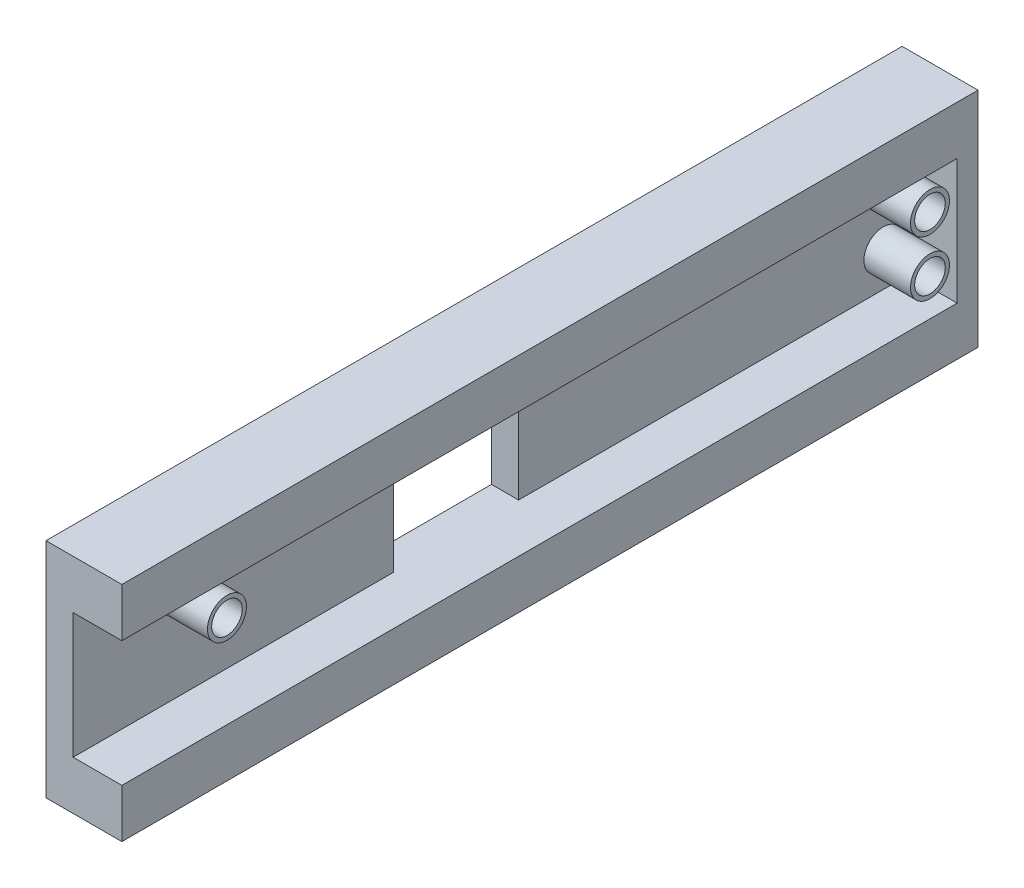
ISO-10303-21;
HEADER;
FILE_DESCRIPTION(('STEP AP214'),'2;1');
FILE_NAME('part.step','',(''),(''),'','','');
FILE_SCHEMA(('AUTOMOTIVE_DESIGN { 1 0 10303 214 1 1 1 1 }'));
ENDSEC;
DATA;
#1=APPLICATION_CONTEXT('core data for automotive mechanical design processes');
#2=APPLICATION_PROTOCOL_DEFINITION('international standard','automotive_design',2000,#1);
#3=PRODUCT_CONTEXT('',#1,'mechanical');
#4=PRODUCT('Part','Part','',(#3));
#5=PRODUCT_RELATED_PRODUCT_CATEGORY('part','',(#4));
#6=PRODUCT_DEFINITION_FORMATION('','',#4);
#7=PRODUCT_DEFINITION_CONTEXT('part definition',#1,'design');
#8=PRODUCT_DEFINITION('design','',#6,#7);
#9=PRODUCT_DEFINITION_SHAPE('','',#8);
#10=(LENGTH_UNIT() NAMED_UNIT(*) SI_UNIT(.MILLI.,.METRE.));
#11=(NAMED_UNIT(*) PLANE_ANGLE_UNIT() SI_UNIT($,.RADIAN.));
#12=(NAMED_UNIT(*) SI_UNIT($,.STERADIAN.) SOLID_ANGLE_UNIT());
#13=UNCERTAINTY_MEASURE_WITH_UNIT(LENGTH_MEASURE(1.E-05),#10,'distance_accuracy_value','');
#14=(GEOMETRIC_REPRESENTATION_CONTEXT(3) GLOBAL_UNCERTAINTY_ASSIGNED_CONTEXT((#13)) GLOBAL_UNIT_ASSIGNED_CONTEXT((#10,
#11,#12)) REPRESENTATION_CONTEXT('',''));
#15=CARTESIAN_POINT('',(0.,0.,0.));
#16=DIRECTION('',(0.,0.,1.));
#17=DIRECTION('',(1.,0.,0.));
#18=AXIS2_PLACEMENT_3D('',#15,#16,#17);
#19=CARTESIAN_POINT('',(-3.5,-4.5,-30.75));
#20=DIRECTION('',(-1.,0.,0.));
#21=DIRECTION('',(0.,0.,1.));
#22=AXIS2_PLACEMENT_3D('',#19,#20,#21);
#23=PLANE('',#22);
#24=CARTESIAN_POINT('',(-3.5,2.,23.05));
#25=DIRECTION('',(-1.,0.,0.));
#26=DIRECTION('',(0.,0.,1.));
#27=AXIS2_PLACEMENT_3D('',#24,#25,#26);
#28=CIRCLE('',#27,1.4);
#29=CARTESIAN_POINT('',(-3.5,2.,24.45));
#30=VERTEX_POINT('',#29);
#31=EDGE_CURVE('E209',#30,#30,#28,.T.);
#32=ORIENTED_EDGE('',*,*,#31,.T.);
#33=EDGE_LOOP('',(#32));
#34=FACE_BOUND('',#33,.T.);
#35=DIRECTION('',(0.,0.,1.));
#36=VECTOR('',#35,1.);
#37=CARTESIAN_POINT('',(-3.5,-4.5,-30.75));
#38=LINE('',#37,#36);
#39=CARTESIAN_POINT('',(-3.5,-4.5,7.75));
#40=VERTEX_POINT('',#39);
#41=CARTESIAN_POINT('',(-3.5,-4.5,30.75));
#42=VERTEX_POINT('',#41);
#43=EDGE_CURVE('E241',#40,#42,#38,.T.);
#44=ORIENTED_EDGE('',*,*,#43,.F.);
#45=DIRECTION('',(0.,1.,0.));
#46=VECTOR('',#45,1.);
#47=CARTESIAN_POINT('',(-3.5,-4.49999999999999,7.75));
#48=LINE('',#47,#46);
#49=CARTESIAN_POINT('',(-3.5,4.5,7.75));
#50=VERTEX_POINT('',#49);
#51=EDGE_CURVE('E167',#40,#50,#48,.T.);
#52=ORIENTED_EDGE('',*,*,#51,.T.);
#53=DIRECTION('',(0.,0.,1.));
#54=VECTOR('',#53,1.);
#55=CARTESIAN_POINT('',(-3.5,4.5,-30.75));
#56=LINE('',#55,#54);
#57=CARTESIAN_POINT('',(-3.5,4.5,30.75));
#58=VERTEX_POINT('',#57);
#59=EDGE_CURVE('E245',#50,#58,#56,.T.);
#60=ORIENTED_EDGE('',*,*,#59,.T.);
#61=DIRECTION('',(0.,-1.,0.));
#62=VECTOR('',#61,1.);
#63=CARTESIAN_POINT('',(-3.5,-4.5,30.75));
#64=LINE('',#63,#62);
#65=EDGE_CURVE('E224',#58,#42,#64,.T.);
#66=ORIENTED_EDGE('',*,*,#65,.T.);
#67=EDGE_LOOP('',(#44,#52,#60,#66));
#68=FACE_BOUND('',#67,.T.);
#69=ADVANCED_FACE('F41',(#34,#68),#23,.F.);
#70=CARTESIAN_POINT('',(0.,-4.5,-30.75));
#71=DIRECTION('',(0.,-1.,0.));
#72=DIRECTION('',(1.,0.,0.));
#73=AXIS2_PLACEMENT_3D('',#70,#71,#72);
#74=PLANE('',#73);
#75=CARTESIAN_POINT('',(-3.5,-4.5,-29.25));
#76=VERTEX_POINT('',#75);
#77=CARTESIAN_POINT('',(-3.5,-4.5,-1.25));
#78=VERTEX_POINT('',#77);
#79=EDGE_CURVE('E237',#76,#78,#38,.T.);
#80=ORIENTED_EDGE('',*,*,#79,.T.);
#81=DIRECTION('',(-1.,0.,0.));
#82=VECTOR('',#81,1.);
#83=CARTESIAN_POINT('',(0.,-4.5,-1.25));
#84=LINE('',#83,#82);
#85=CARTESIAN_POINT('',(-5.44999999999999,-4.5,-1.25));
#86=VERTEX_POINT('',#85);
#87=EDGE_CURVE('E138',#78,#86,#84,.T.);
#88=ORIENTED_EDGE('',*,*,#87,.T.);
#89=DIRECTION('',(0.,0.,1.));
#90=VECTOR('',#89,1.);
#91=CARTESIAN_POINT('',(-5.44999999999999,-4.5,-1.25));
#92=LINE('',#91,#90);
#93=CARTESIAN_POINT('',(-5.44999999999999,-4.5,7.75));
#94=VERTEX_POINT('',#93);
#95=EDGE_CURVE('E151',#86,#94,#92,.T.);
#96=ORIENTED_EDGE('',*,*,#95,.T.);
#97=DIRECTION('',(-1.,0.,0.));
#98=VECTOR('',#97,1.);
#99=CARTESIAN_POINT('',(0.,-4.5,7.75));
#100=LINE('',#99,#98);
#101=EDGE_CURVE('E158',#40,#94,#100,.T.);
#102=ORIENTED_EDGE('',*,*,#101,.F.);
#103=ORIENTED_EDGE('',*,*,#43,.T.);
#104=DIRECTION('',(1.,0.,0.));
#105=VECTOR('',#104,1.);
#106=CARTESIAN_POINT('',(0.,-4.5,30.75));
#107=LINE('',#106,#105);
#108=CARTESIAN_POINT('',(0.,-4.5,30.75));
#109=VERTEX_POINT('',#108);
#110=EDGE_CURVE('E228',#42,#109,#107,.T.);
#111=ORIENTED_EDGE('',*,*,#110,.T.);
#112=DIRECTION('',(0.,0.,1.));
#113=VECTOR('',#112,1.);
#114=CARTESIAN_POINT('',(0.,-4.5,-30.75));
#115=LINE('',#114,#113);
#116=CARTESIAN_POINT('',(0.,-4.5,-29.25));
#117=VERTEX_POINT('',#116);
#118=EDGE_CURVE('E233',#117,#109,#115,.T.);
#119=ORIENTED_EDGE('',*,*,#118,.F.);
#120=DIRECTION('',(1.,0.,0.));
#121=VECTOR('',#120,1.);
#122=CARTESIAN_POINT('',(0.,-4.5,-29.25));
#123=LINE('',#122,#121);
#124=EDGE_CURVE('E178',#76,#117,#123,.T.);
#125=ORIENTED_EDGE('',*,*,#124,.F.);
#126=EDGE_LOOP('',(#80,#88,#96,#102,#103,#111,#119,#125));
#127=FACE_BOUND('',#126,.T.);
#128=ADVANCED_FACE('F316',(#127),#74,.F.);
#129=CARTESIAN_POINT('',(-3.5,2.,-27.45));
#130=DIRECTION('',(-1.,0.,0.));
#131=DIRECTION('',(0.,0.,1.));
#132=AXIS2_PLACEMENT_3D('',#129,#130,#131);
#133=CIRCLE('',#132,1.4);
#134=CARTESIAN_POINT('',(-3.5,2.,-26.05));
#135=VERTEX_POINT('',#134);
#136=EDGE_CURVE('E219',#135,#135,#133,.T.);
#137=ORIENTED_EDGE('',*,*,#136,.T.);
#138=EDGE_LOOP('',(#137));
#139=FACE_BOUND('',#138,.T.);
#140=CARTESIAN_POINT('',(-3.5,-2.00000000000002,-27.45));
#141=DIRECTION('',(-1.,0.,0.));
#142=DIRECTION('',(0.,0.,1.));
#143=AXIS2_PLACEMENT_3D('',#140,#141,#142);
#144=CIRCLE('',#143,1.4);
#145=CARTESIAN_POINT('',(-3.5,-2.00000000000002,-26.05));
#146=VERTEX_POINT('',#145);
#147=EDGE_CURVE('E214',#146,#146,#144,.T.);
#148=ORIENTED_EDGE('',*,*,#147,.T.);
#149=EDGE_LOOP('',(#148));
#150=FACE_BOUND('',#149,.T.);
#151=CARTESIAN_POINT('',(-3.5,4.5,-29.25));
#152=VERTEX_POINT('',#151);
#153=CARTESIAN_POINT('',(-3.5,4.5,-1.25));
#154=VERTEX_POINT('',#153);
#155=EDGE_CURVE('E242',#152,#154,#56,.T.);
#156=ORIENTED_EDGE('',*,*,#155,.T.);
#157=DIRECTION('',(0.,-1.,0.));
#158=VECTOR('',#157,1.);
#159=CARTESIAN_POINT('',(-3.5,-4.5,-1.25));
#160=LINE('',#159,#158);
#161=EDGE_CURVE('E135',#154,#78,#160,.T.);
#162=ORIENTED_EDGE('',*,*,#161,.T.);
#163=ORIENTED_EDGE('',*,*,#79,.F.);
#164=DIRECTION('',(0.,-1.,0.));
#165=VECTOR('',#164,1.);
#166=CARTESIAN_POINT('',(-3.5,-4.5,-29.25));
#167=LINE('',#166,#165);
#168=EDGE_CURVE('E175',#152,#76,#167,.T.);
#169=ORIENTED_EDGE('',*,*,#168,.F.);
#170=EDGE_LOOP('',(#156,#162,#163,#169));
#171=FACE_BOUND('',#170,.T.);
#172=ADVANCED_FACE('F318',(#139,#150,#171),#23,.F.);
#173=CARTESIAN_POINT('',(0.,4.5,-30.75));
#174=DIRECTION('',(0.,1.,0.));
#175=DIRECTION('',(-1.,0.,0.));
#176=AXIS2_PLACEMENT_3D('',#173,#174,#175);
#177=PLANE('',#176);
#178=DIRECTION('',(0.,0.,1.));
#179=VECTOR('',#178,1.);
#180=CARTESIAN_POINT('',(0.,4.5,-30.75));
#181=LINE('',#180,#179);
#182=CARTESIAN_POINT('',(0.,4.5,-29.25));
#183=VERTEX_POINT('',#182);
#184=CARTESIAN_POINT('',(0.,4.5,30.75));
#185=VERTEX_POINT('',#184);
#186=EDGE_CURVE('E232',#183,#185,#181,.T.);
#187=ORIENTED_EDGE('',*,*,#186,.T.);
#188=DIRECTION('',(-1.,0.,0.));
#189=VECTOR('',#188,1.);
#190=CARTESIAN_POINT('',(0.,4.5,30.75));
#191=LINE('',#190,#189);
#192=EDGE_CURVE('E220',#185,#58,#191,.T.);
#193=ORIENTED_EDGE('',*,*,#192,.T.);
#194=ORIENTED_EDGE('',*,*,#59,.F.);
#195=DIRECTION('',(-1.,0.,0.));
#196=VECTOR('',#195,1.);
#197=CARTESIAN_POINT('',(0.,4.5,7.75));
#198=LINE('',#197,#196);
#199=CARTESIAN_POINT('',(-5.44999999999999,4.5,7.75));
#200=VERTEX_POINT('',#199);
#201=EDGE_CURVE('E139',#50,#200,#198,.T.);
#202=ORIENTED_EDGE('',*,*,#201,.T.);
#203=DIRECTION('',(0.,0.,-1.));
#204=VECTOR('',#203,1.);
#205=CARTESIAN_POINT('',(-5.44999999999999,4.5,-1.25));
#206=LINE('',#205,#204);
#207=CARTESIAN_POINT('',(-5.44999999999999,4.5,-1.25));
#208=VERTEX_POINT('',#207);
#209=EDGE_CURVE('E142',#200,#208,#206,.T.);
#210=ORIENTED_EDGE('',*,*,#209,.T.);
#211=DIRECTION('',(-1.,0.,0.));
#212=VECTOR('',#211,1.);
#213=CARTESIAN_POINT('',(0.,4.5,-1.25));
#214=LINE('',#213,#212);
#215=EDGE_CURVE('E57',#154,#208,#214,.T.);
#216=ORIENTED_EDGE('',*,*,#215,.F.);
#217=ORIENTED_EDGE('',*,*,#155,.F.);
#218=DIRECTION('',(-1.,0.,0.));
#219=VECTOR('',#218,1.);
#220=CARTESIAN_POINT('',(0.,4.5,-29.25));
#221=LINE('',#220,#219);
#222=EDGE_CURVE('E11',#183,#152,#221,.T.);
#223=ORIENTED_EDGE('',*,*,#222,.F.);
#224=EDGE_LOOP('',(#187,#193,#194,#202,#210,#216,#217,#223));
#225=FACE_BOUND('',#224,.T.);
#226=ADVANCED_FACE('F143',(#225),#177,.F.);
#227=CARTESIAN_POINT('',(0.,8.,-30.75));
#228=DIRECTION('',(-1.,0.,0.));
#229=DIRECTION('',(0.,0.,1.));
#230=AXIS2_PLACEMENT_3D('',#227,#228,#229);
#231=PLANE('',#230);
#232=DIRECTION('',(0.,-1.,0.));
#233=VECTOR('',#232,1.);
#234=CARTESIAN_POINT('',(0.,8.,-30.75));
#235=LINE('',#234,#233);
#236=CARTESIAN_POINT('',(0.,8.,-30.75));
#237=VERTEX_POINT('',#236);
#238=CARTESIAN_POINT('',(0.,-8.,-30.75));
#239=VERTEX_POINT('',#238);
#240=EDGE_CURVE('E50',#237,#239,#235,.T.);
#241=ORIENTED_EDGE('',*,*,#240,.F.);
#242=DIRECTION('',(0.,0.,-1.));
#243=VECTOR('',#242,1.);
#244=CARTESIAN_POINT('',(0.,8.,-30.75));
#245=LINE('',#244,#243);
#246=CARTESIAN_POINT('',(0.,8.,30.75));
#247=VERTEX_POINT('',#246);
#248=EDGE_CURVE('E248',#247,#237,#245,.T.);
#249=ORIENTED_EDGE('',*,*,#248,.F.);
#250=DIRECTION('',(0.,-1.,0.));
#251=VECTOR('',#250,1.);
#252=CARTESIAN_POINT('',(0.,8.,30.75));
#253=LINE('',#252,#251);
#254=EDGE_CURVE('E273',#247,#185,#253,.T.);
#255=ORIENTED_EDGE('',*,*,#254,.T.);
#256=ORIENTED_EDGE('',*,*,#186,.F.);
#257=DIRECTION('',(0.,-1.,0.));
#258=VECTOR('',#257,1.);
#259=CARTESIAN_POINT('',(0.,8.,-29.25));
#260=LINE('',#259,#258);
#261=EDGE_CURVE('E171',#183,#117,#260,.T.);
#262=ORIENTED_EDGE('',*,*,#261,.T.);
#263=ORIENTED_EDGE('',*,*,#118,.T.);
#264=CARTESIAN_POINT('',(0.,-8.,30.75));
#265=VERTEX_POINT('',#264);
#266=EDGE_CURVE('E261',#109,#265,#253,.T.);
#267=ORIENTED_EDGE('',*,*,#266,.T.);
#268=DIRECTION('',(0.,0.,-1.));
#269=VECTOR('',#268,1.);
#270=CARTESIAN_POINT('',(0.,-8.,-30.75));
#271=LINE('',#270,#269);
#272=EDGE_CURVE('E236',#265,#239,#271,.T.);
#273=ORIENTED_EDGE('',*,*,#272,.T.);
#274=EDGE_LOOP('',(#241,#249,#255,#256,#262,#263,#267,#273));
#275=FACE_BOUND('',#274,.T.);
#276=ADVANCED_FACE('F43',(#275),#231,.F.);
#277=CARTESIAN_POINT('',(0.,8.,-30.75));
#278=DIRECTION('',(0.,0.,1.));
#279=DIRECTION('',(1.,0.,0.));
#280=AXIS2_PLACEMENT_3D('',#277,#278,#279);
#281=PLANE('',#280);
#282=DIRECTION('',(0.,-1.,0.));
#283=VECTOR('',#282,1.);
#284=CARTESIAN_POINT('',(-5.44999999999999,8.,-30.75));
#285=LINE('',#284,#283);
#286=CARTESIAN_POINT('',(-5.44999999999999,8.,-30.75));
#287=VERTEX_POINT('',#286);
#288=CARTESIAN_POINT('',(-5.44999999999999,-8.,-30.75));
#289=VERTEX_POINT('',#288);
#290=EDGE_CURVE('E281',#287,#289,#285,.T.);
#291=ORIENTED_EDGE('',*,*,#290,.F.);
#292=DIRECTION('',(-1.,0.,0.));
#293=VECTOR('',#292,1.);
#294=CARTESIAN_POINT('',(0.,8.,-30.75));
#295=LINE('',#294,#293);
#296=EDGE_CURVE('E251',#237,#287,#295,.T.);
#297=ORIENTED_EDGE('',*,*,#296,.F.);
#298=ORIENTED_EDGE('',*,*,#240,.T.);
#299=DIRECTION('',(-1.,0.,0.));
#300=VECTOR('',#299,1.);
#301=CARTESIAN_POINT('',(0.,-8.,-30.75));
#302=LINE('',#301,#300);
#303=EDGE_CURVE('E264',#239,#289,#302,.T.);
#304=ORIENTED_EDGE('',*,*,#303,.T.);
#305=EDGE_LOOP('',(#291,#297,#298,#304));
#306=FACE_BOUND('',#305,.T.);
#307=ADVANCED_FACE('F363',(#306),#281,.F.);
#308=CARTESIAN_POINT('',(-5.44999999999999,8.,30.75));
#309=DIRECTION('',(1.,0.,0.));
#310=DIRECTION('',(0.,0.,-1.));
#311=AXIS2_PLACEMENT_3D('',#308,#309,#310);
#312=PLANE('',#311);
#313=ORIENTED_EDGE('',*,*,#209,.F.);
#314=DIRECTION('',(0.,1.,0.));
#315=VECTOR('',#314,1.);
#316=CARTESIAN_POINT('',(-5.44999999999999,4.5,7.75));
#317=LINE('',#316,#315);
#318=EDGE_CURVE('E65',#94,#200,#317,.T.);
#319=ORIENTED_EDGE('',*,*,#318,.F.);
#320=ORIENTED_EDGE('',*,*,#95,.F.);
#321=DIRECTION('',(0.,-1.,0.));
#322=VECTOR('',#321,1.);
#323=CARTESIAN_POINT('',(-5.44999999999999,4.5,-1.25));
#324=LINE('',#323,#322);
#325=EDGE_CURVE('E132',#208,#86,#324,.T.);
#326=ORIENTED_EDGE('',*,*,#325,.F.);
#327=EDGE_LOOP('',(#313,#319,#320,#326));
#328=FACE_BOUND('',#327,.T.);
#329=CARTESIAN_POINT('',(-5.44999999999999,2.,23.05));
#330=DIRECTION('',(1.,0.,0.));
#331=DIRECTION('',(0.,0.,-1.));
#332=AXIS2_PLACEMENT_3D('',#329,#330,#331);
#333=CIRCLE('',#332,1.1);
#334=CARTESIAN_POINT('',(-5.44999999999999,2.,21.95));
#335=VERTEX_POINT('',#334);
#336=EDGE_CURVE('E182',#335,#335,#333,.T.);
#337=ORIENTED_EDGE('',*,*,#336,.T.);
#338=EDGE_LOOP('',(#337));
#339=FACE_BOUND('',#338,.T.);
#340=CARTESIAN_POINT('',(-5.44999999999999,2.,-27.45));
#341=DIRECTION('',(1.,0.,0.));
#342=DIRECTION('',(0.,0.,-1.));
#343=AXIS2_PLACEMENT_3D('',#340,#341,#342);
#344=CIRCLE('',#343,1.1);
#345=CARTESIAN_POINT('',(-5.44999999999999,2.,-28.55));
#346=VERTEX_POINT('',#345);
#347=EDGE_CURVE('E191',#346,#346,#344,.T.);
#348=ORIENTED_EDGE('',*,*,#347,.T.);
#349=EDGE_LOOP('',(#348));
#350=FACE_BOUND('',#349,.T.);
#351=CARTESIAN_POINT('',(-5.44999999999999,-2.00000000000002,-27.45));
#352=DIRECTION('',(1.,0.,0.));
#353=DIRECTION('',(0.,0.,-1.));
#354=AXIS2_PLACEMENT_3D('',#351,#352,#353);
#355=CIRCLE('',#354,1.1);
#356=CARTESIAN_POINT('',(-5.44999999999999,-2.00000000000002,-28.55));
#357=VERTEX_POINT('',#356);
#358=EDGE_CURVE('E199',#357,#357,#355,.T.);
#359=ORIENTED_EDGE('',*,*,#358,.T.);
#360=EDGE_LOOP('',(#359));
#361=FACE_BOUND('',#360,.T.);
#362=DIRECTION('',(0.,0.,1.));
#363=VECTOR('',#362,1.);
#364=CARTESIAN_POINT('',(-5.44999999999999,-8.,30.75));
#365=LINE('',#364,#363);
#366=CARTESIAN_POINT('',(-5.44999999999999,-8.,30.75));
#367=VERTEX_POINT('',#366);
#368=EDGE_CURVE('E267',#289,#367,#365,.T.);
#369=ORIENTED_EDGE('',*,*,#368,.T.);
#370=DIRECTION('',(0.,-1.,0.));
#371=VECTOR('',#370,1.);
#372=CARTESIAN_POINT('',(-5.44999999999999,8.,30.75));
#373=LINE('',#372,#371);
#374=CARTESIAN_POINT('',(-5.44999999999999,8.,30.75));
#375=VERTEX_POINT('',#374);
#376=EDGE_CURVE('E277',#375,#367,#373,.T.);
#377=ORIENTED_EDGE('',*,*,#376,.F.);
#378=DIRECTION('',(0.,0.,1.));
#379=VECTOR('',#378,1.);
#380=CARTESIAN_POINT('',(-5.44999999999999,8.,30.75));
#381=LINE('',#380,#379);
#382=EDGE_CURVE('E255',#287,#375,#381,.T.);
#383=ORIENTED_EDGE('',*,*,#382,.F.);
#384=ORIENTED_EDGE('',*,*,#290,.T.);
#385=EDGE_LOOP('',(#369,#377,#383,#384));
#386=FACE_BOUND('',#385,.T.);
#387=ADVANCED_FACE('F148',(#328,#339,#350,#361,#386),#312,.F.);
#388=CARTESIAN_POINT('',(0.,8.,30.75));
#389=DIRECTION('',(0.,0.,-1.));
#390=DIRECTION('',(-1.,0.,0.));
#391=AXIS2_PLACEMENT_3D('',#388,#389,#390);
#392=PLANE('',#391);
#393=ORIENTED_EDGE('',*,*,#266,.F.);
#394=ORIENTED_EDGE('',*,*,#110,.F.);
#395=ORIENTED_EDGE('',*,*,#65,.F.);
#396=ORIENTED_EDGE('',*,*,#192,.F.);
#397=ORIENTED_EDGE('',*,*,#254,.F.);
#398=DIRECTION('',(1.,0.,0.));
#399=VECTOR('',#398,1.);
#400=CARTESIAN_POINT('',(0.,8.,30.75));
#401=LINE('',#400,#399);
#402=EDGE_CURVE('E258',#375,#247,#401,.T.);
#403=ORIENTED_EDGE('',*,*,#402,.F.);
#404=ORIENTED_EDGE('',*,*,#376,.T.);
#405=DIRECTION('',(1.,0.,0.));
#406=VECTOR('',#405,1.);
#407=CARTESIAN_POINT('',(0.,-8.,30.75));
#408=LINE('',#407,#406);
#409=EDGE_CURVE('E252',#367,#265,#408,.T.);
#410=ORIENTED_EDGE('',*,*,#409,.T.);
#411=EDGE_LOOP('',(#393,#394,#395,#396,#397,#403,#404,#410));
#412=FACE_BOUND('',#411,.T.);
#413=ADVANCED_FACE('F348',(#412),#392,.F.);
#414=CARTESIAN_POINT('',(0.,8.,0.));
#415=DIRECTION('',(0.,-1.,0.));
#416=DIRECTION('',(0.,0.,-1.));
#417=AXIS2_PLACEMENT_3D('',#414,#415,#416);
#418=PLANE('',#417);
#419=ORIENTED_EDGE('',*,*,#296,.T.);
#420=ORIENTED_EDGE('',*,*,#382,.T.);
#421=ORIENTED_EDGE('',*,*,#402,.T.);
#422=ORIENTED_EDGE('',*,*,#248,.T.);
#423=EDGE_LOOP('',(#419,#420,#421,#422));
#424=FACE_BOUND('',#423,.T.);
#425=ADVANCED_FACE('F368',(#424),#418,.F.);
#426=CARTESIAN_POINT('',(0.,-8.,0.));
#427=DIRECTION('',(0.,-1.,0.));
#428=DIRECTION('',(0.,0.,-1.));
#429=AXIS2_PLACEMENT_3D('',#426,#427,#428);
#430=PLANE('',#429);
#431=ORIENTED_EDGE('',*,*,#368,.F.);
#432=ORIENTED_EDGE('',*,*,#303,.F.);
#433=ORIENTED_EDGE('',*,*,#272,.F.);
#434=ORIENTED_EDGE('',*,*,#409,.F.);
#435=EDGE_LOOP('',(#431,#432,#433,#434));
#436=FACE_BOUND('',#435,.T.);
#437=ADVANCED_FACE('F360',(#436),#430,.T.);
#438=CARTESIAN_POINT('',(-0.149999999999993,2.,-27.45));
#439=DIRECTION('',(-1.,0.,0.));
#440=DIRECTION('',(0.,0.,1.));
#441=AXIS2_PLACEMENT_3D('',#438,#439,#440);
#442=CYLINDRICAL_SURFACE('',#441,1.4);
#443=CARTESIAN_POINT('',(-0.149999999999993,2.,-27.45));
#444=DIRECTION('',(-1.,0.,0.));
#445=DIRECTION('',(0.,0.,1.));
#446=AXIS2_PLACEMENT_3D('',#443,#444,#445);
#447=CIRCLE('',#446,1.4);
#448=CARTESIAN_POINT('',(-0.149999999999993,2.,-26.05));
#449=VERTEX_POINT('',#448);
#450=EDGE_CURVE('E215',#449,#449,#447,.T.);
#451=ORIENTED_EDGE('',*,*,#450,.T.);
#452=EDGE_LOOP('',(#451));
#453=FACE_BOUND('',#452,.T.);
#454=ORIENTED_EDGE('',*,*,#136,.F.);
#455=EDGE_LOOP('',(#454));
#456=FACE_BOUND('',#455,.T.);
#457=ADVANCED_FACE('F375',(#453,#456),#442,.T.);
#458=CARTESIAN_POINT('',(-0.149999999999993,2.,-27.45));
#459=DIRECTION('',(-1.,0.,0.));
#460=DIRECTION('',(0.,0.,1.));
#461=AXIS2_PLACEMENT_3D('',#458,#459,#460);
#462=PLANE('',#461);
#463=CARTESIAN_POINT('',(-0.149999999999993,2.,-27.45));
#464=DIRECTION('',(1.,0.,0.));
#465=DIRECTION('',(0.,0.,-1.));
#466=AXIS2_PLACEMENT_3D('',#463,#464,#465);
#467=CIRCLE('',#466,1.1);
#468=CARTESIAN_POINT('',(-0.149999999999993,2.,-28.55));
#469=VERTEX_POINT('',#468);
#470=EDGE_CURVE('E195',#469,#469,#467,.T.);
#471=ORIENTED_EDGE('',*,*,#470,.F.);
#472=EDGE_LOOP('',(#471));
#473=FACE_BOUND('',#472,.T.);
#474=ORIENTED_EDGE('',*,*,#450,.F.);
#475=EDGE_LOOP('',(#474));
#476=FACE_BOUND('',#475,.T.);
#477=ADVANCED_FACE('F486',(#473,#476),#462,.F.);
#478=CARTESIAN_POINT('',(-0.149999999999993,-2.00000000000002,-27.45));
#479=DIRECTION('',(-1.,0.,0.));
#480=DIRECTION('',(0.,0.,1.));
#481=AXIS2_PLACEMENT_3D('',#478,#479,#480);
#482=CYLINDRICAL_SURFACE('',#481,1.4);
#483=CARTESIAN_POINT('',(-0.149999999999993,-2.00000000000002,-27.45));
#484=DIRECTION('',(-1.,0.,0.));
#485=DIRECTION('',(0.,0.,1.));
#486=AXIS2_PLACEMENT_3D('',#483,#484,#485);
#487=CIRCLE('',#486,1.4);
#488=CARTESIAN_POINT('',(-0.149999999999993,-2.00000000000002,-26.05));
#489=VERTEX_POINT('',#488);
#490=EDGE_CURVE('E210',#489,#489,#487,.T.);
#491=ORIENTED_EDGE('',*,*,#490,.T.);
#492=EDGE_LOOP('',(#491));
#493=FACE_BOUND('',#492,.T.);
#494=ORIENTED_EDGE('',*,*,#147,.F.);
#495=EDGE_LOOP('',(#494));
#496=FACE_BOUND('',#495,.T.);
#497=ADVANCED_FACE('F312',(#493,#496),#482,.T.);
#498=CARTESIAN_POINT('',(-0.149999999999993,-2.00000000000002,-27.45));
#499=DIRECTION('',(-1.,0.,0.));
#500=DIRECTION('',(0.,0.,1.));
#501=AXIS2_PLACEMENT_3D('',#498,#499,#500);
#502=PLANE('',#501);
#503=CARTESIAN_POINT('',(-0.149999999999993,-2.00000000000002,-27.45));
#504=DIRECTION('',(1.,0.,0.));
#505=DIRECTION('',(0.,0.,-1.));
#506=AXIS2_PLACEMENT_3D('',#503,#504,#505);
#507=CIRCLE('',#506,1.1);
#508=CARTESIAN_POINT('',(-0.149999999999993,-2.00000000000002,-28.55));
#509=VERTEX_POINT('',#508);
#510=EDGE_CURVE('E181',#509,#509,#507,.T.);
#511=ORIENTED_EDGE('',*,*,#510,.F.);
#512=EDGE_LOOP('',(#511));
#513=FACE_BOUND('',#512,.T.);
#514=ORIENTED_EDGE('',*,*,#490,.F.);
#515=EDGE_LOOP('',(#514));
#516=FACE_BOUND('',#515,.T.);
#517=ADVANCED_FACE('F302',(#513,#516),#502,.F.);
#518=CARTESIAN_POINT('',(-0.149999999999993,2.,23.05));
#519=DIRECTION('',(-1.,0.,0.));
#520=DIRECTION('',(0.,0.,1.));
#521=AXIS2_PLACEMENT_3D('',#518,#519,#520);
#522=CYLINDRICAL_SURFACE('',#521,1.4);
#523=CARTESIAN_POINT('',(-0.149999999999993,2.,23.05));
#524=DIRECTION('',(-1.,0.,0.));
#525=DIRECTION('',(0.,0.,1.));
#526=AXIS2_PLACEMENT_3D('',#523,#524,#525);
#527=CIRCLE('',#526,1.4);
#528=CARTESIAN_POINT('',(-0.149999999999993,2.,24.45));
#529=VERTEX_POINT('',#528);
#530=EDGE_CURVE('E186',#529,#529,#527,.T.);
#531=ORIENTED_EDGE('',*,*,#530,.T.);
#532=EDGE_LOOP('',(#531));
#533=FACE_BOUND('',#532,.T.);
#534=ORIENTED_EDGE('',*,*,#31,.F.);
#535=EDGE_LOOP('',(#534));
#536=FACE_BOUND('',#535,.T.);
#537=ADVANCED_FACE('F299',(#533,#536),#522,.T.);
#538=CARTESIAN_POINT('',(-0.149999999999993,2.,23.05));
#539=DIRECTION('',(-1.,0.,0.));
#540=DIRECTION('',(0.,0.,1.));
#541=AXIS2_PLACEMENT_3D('',#538,#539,#540);
#542=PLANE('',#541);
#543=CARTESIAN_POINT('',(-0.149999999999993,2.,23.05));
#544=DIRECTION('',(1.,0.,0.));
#545=DIRECTION('',(0.,0.,-1.));
#546=AXIS2_PLACEMENT_3D('',#543,#544,#545);
#547=CIRCLE('',#546,1.1);
#548=CARTESIAN_POINT('',(-0.149999999999993,2.,21.95));
#549=VERTEX_POINT('',#548);
#550=EDGE_CURVE('E187',#549,#549,#547,.T.);
#551=ORIENTED_EDGE('',*,*,#550,.F.);
#552=EDGE_LOOP('',(#551));
#553=FACE_BOUND('',#552,.T.);
#554=ORIENTED_EDGE('',*,*,#530,.F.);
#555=EDGE_LOOP('',(#554));
#556=FACE_BOUND('',#555,.T.);
#557=ADVANCED_FACE('F301',(#553,#556),#542,.F.);
#558=CARTESIAN_POINT('',(-5.44999999999999,2.,23.05));
#559=DIRECTION('',(1.,0.,0.));
#560=DIRECTION('',(0.,0.,-1.));
#561=AXIS2_PLACEMENT_3D('',#558,#559,#560);
#562=CYLINDRICAL_SURFACE('',#561,1.1);
#563=ORIENTED_EDGE('',*,*,#336,.F.);
#564=EDGE_LOOP('',(#563));
#565=FACE_BOUND('',#564,.T.);
#566=ORIENTED_EDGE('',*,*,#550,.T.);
#567=EDGE_LOOP('',(#566));
#568=FACE_BOUND('',#567,.T.);
#569=ADVANCED_FACE('F309',(#565,#568),#562,.F.);
#570=CARTESIAN_POINT('',(-5.44999999999999,-2.00000000000002,-27.45));
#571=DIRECTION('',(1.,0.,0.));
#572=DIRECTION('',(0.,0.,-1.));
#573=AXIS2_PLACEMENT_3D('',#570,#571,#572);
#574=CYLINDRICAL_SURFACE('',#573,1.1);
#575=ORIENTED_EDGE('',*,*,#358,.F.);
#576=EDGE_LOOP('',(#575));
#577=FACE_BOUND('',#576,.T.);
#578=ORIENTED_EDGE('',*,*,#510,.T.);
#579=EDGE_LOOP('',(#578));
#580=FACE_BOUND('',#579,.T.);
#581=ADVANCED_FACE('F447',(#577,#580),#574,.F.);
#582=CARTESIAN_POINT('',(-5.44999999999999,2.,-27.45));
#583=DIRECTION('',(1.,0.,0.));
#584=DIRECTION('',(0.,0.,-1.));
#585=AXIS2_PLACEMENT_3D('',#582,#583,#584);
#586=CYLINDRICAL_SURFACE('',#585,1.1);
#587=ORIENTED_EDGE('',*,*,#347,.F.);
#588=EDGE_LOOP('',(#587));
#589=FACE_BOUND('',#588,.T.);
#590=ORIENTED_EDGE('',*,*,#470,.T.);
#591=EDGE_LOOP('',(#590));
#592=FACE_BOUND('',#591,.T.);
#593=ADVANCED_FACE('F419',(#589,#592),#586,.F.);
#594=CARTESIAN_POINT('',(0.,0.,-29.25));
#595=DIRECTION('',(0.,0.,-1.));
#596=DIRECTION('',(-1.,0.,0.));
#597=AXIS2_PLACEMENT_3D('',#594,#595,#596);
#598=PLANE('',#597);
#599=ORIENTED_EDGE('',*,*,#168,.T.);
#600=ORIENTED_EDGE('',*,*,#124,.T.);
#601=ORIENTED_EDGE('',*,*,#261,.F.);
#602=ORIENTED_EDGE('',*,*,#222,.T.);
#603=EDGE_LOOP('',(#599,#600,#601,#602));
#604=FACE_BOUND('',#603,.T.);
#605=ADVANCED_FACE('F414',(#604),#598,.F.);
#606=CARTESIAN_POINT('',(0.,4.5,7.75));
#607=DIRECTION('',(0.,0.,1.));
#608=DIRECTION('',(0.,-1.,0.));
#609=AXIS2_PLACEMENT_3D('',#606,#607,#608);
#610=PLANE('',#609);
#611=ORIENTED_EDGE('',*,*,#101,.T.);
#612=ORIENTED_EDGE('',*,*,#318,.T.);
#613=ORIENTED_EDGE('',*,*,#201,.F.);
#614=ORIENTED_EDGE('',*,*,#51,.F.);
#615=EDGE_LOOP('',(#611,#612,#613,#614));
#616=FACE_BOUND('',#615,.T.);
#617=ADVANCED_FACE('F418',(#616),#610,.F.);
#618=CARTESIAN_POINT('',(0.,4.5,-1.25));
#619=DIRECTION('',(0.,0.,-1.));
#620=DIRECTION('',(0.,1.,0.));
#621=AXIS2_PLACEMENT_3D('',#618,#619,#620);
#622=PLANE('',#621);
#623=ORIENTED_EDGE('',*,*,#215,.T.);
#624=ORIENTED_EDGE('',*,*,#325,.T.);
#625=ORIENTED_EDGE('',*,*,#87,.F.);
#626=ORIENTED_EDGE('',*,*,#161,.F.);
#627=EDGE_LOOP('',(#623,#624,#625,#626));
#628=FACE_BOUND('',#627,.T.);
#629=ADVANCED_FACE('F130',(#628),#622,.F.);
#630=CLOSED_SHELL('',(#69,#128,#172,#226,#276,#307,#387,#413,#425,#437,#457,#477,#497,#517,#537,
#557,#569,#581,#593,#605,#617,#629));
#631=MANIFOLD_SOLID_BREP('B2',#630);
#632=ADVANCED_BREP_SHAPE_REPRESENTATION('',(#18,#631),#14);
#633=SHAPE_DEFINITION_REPRESENTATION(#9,#632);
ENDSEC;
END-ISO-10303-21;
